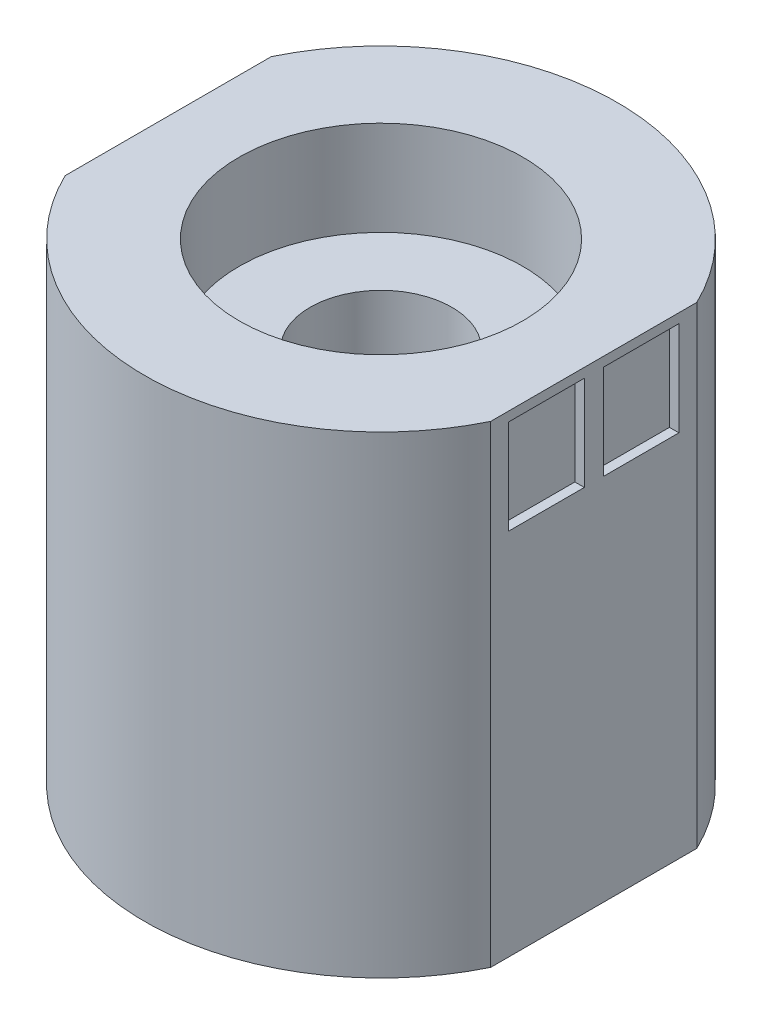
ISO-10303-21;
HEADER;
FILE_DESCRIPTION(('STEP AP214'),'2;1');
FILE_NAME('part.step','',(''),(''),'','','');
FILE_SCHEMA(('AUTOMOTIVE_DESIGN { 1 0 10303 214 1 1 1 1 }'));
ENDSEC;
DATA;
#1=APPLICATION_CONTEXT('core data for automotive mechanical design processes');
#2=APPLICATION_PROTOCOL_DEFINITION('international standard','automotive_design',2000,#1);
#3=PRODUCT_CONTEXT('',#1,'mechanical');
#4=PRODUCT('Part','Part','',(#3));
#5=PRODUCT_RELATED_PRODUCT_CATEGORY('part','',(#4));
#6=PRODUCT_DEFINITION_FORMATION('','',#4);
#7=PRODUCT_DEFINITION_CONTEXT('part definition',#1,'design');
#8=PRODUCT_DEFINITION('design','',#6,#7);
#9=PRODUCT_DEFINITION_SHAPE('','',#8);
#10=(LENGTH_UNIT() NAMED_UNIT(*) SI_UNIT(.MILLI.,.METRE.));
#11=(NAMED_UNIT(*) PLANE_ANGLE_UNIT() SI_UNIT($,.RADIAN.));
#12=(NAMED_UNIT(*) SI_UNIT($,.STERADIAN.) SOLID_ANGLE_UNIT());
#13=UNCERTAINTY_MEASURE_WITH_UNIT(LENGTH_MEASURE(1.E-05),#10,'distance_accuracy_value','');
#14=(GEOMETRIC_REPRESENTATION_CONTEXT(3) GLOBAL_UNCERTAINTY_ASSIGNED_CONTEXT((#13)) GLOBAL_UNIT_ASSIGNED_CONTEXT((#10,
#11,#12)) REPRESENTATION_CONTEXT('',''));
#15=CARTESIAN_POINT('',(0.,0.,0.));
#16=DIRECTION('',(0.,0.,1.));
#17=DIRECTION('',(1.,0.,0.));
#18=AXIS2_PLACEMENT_3D('',#15,#16,#17);
#19=CARTESIAN_POINT('',(22.5,0.,-10.8972473588517));
#20=DIRECTION('',(1.,0.,0.));
#21=DIRECTION('',(0.,0.,-1.));
#22=AXIS2_PLACEMENT_3D('',#19,#20,#21);
#23=PLANE('',#22);
#24=DIRECTION('',(0.,0.,-1.));
#25=VECTOR('',#24,1.);
#26=CARTESIAN_POINT('',(22.5,50.,-10.8972473588517));
#27=LINE('',#26,#25);
#28=CARTESIAN_POINT('',(22.5,50.,10.8972473588517));
#29=VERTEX_POINT('',#28);
#30=CARTESIAN_POINT('',(22.5,50.,-10.8972473588517));
#31=VERTEX_POINT('',#30);
#32=EDGE_CURVE('E310',#29,#31,#27,.T.);
#33=ORIENTED_EDGE('',*,*,#32,.F.);
#34=DIRECTION('',(0.,1.,0.));
#35=VECTOR('',#34,1.);
#36=CARTESIAN_POINT('',(22.5,0.,10.8972473588517));
#37=LINE('',#36,#35);
#38=CARTESIAN_POINT('',(22.5,0.,10.8972473588517));
#39=VERTEX_POINT('',#38);
#40=EDGE_CURVE('E320',#39,#29,#37,.T.);
#41=ORIENTED_EDGE('',*,*,#40,.F.);
#42=DIRECTION('',(0.,0.,-1.));
#43=VECTOR('',#42,1.);
#44=CARTESIAN_POINT('',(22.5,0.,-10.8972473588517));
#45=LINE('',#44,#43);
#46=CARTESIAN_POINT('',(22.5,0.,-10.8972473588517));
#47=VERTEX_POINT('',#46);
#48=EDGE_CURVE('E309',#39,#47,#45,.T.);
#49=ORIENTED_EDGE('',*,*,#48,.T.);
#50=DIRECTION('',(0.,1.,0.));
#51=VECTOR('',#50,1.);
#52=CARTESIAN_POINT('',(22.5,0.,-10.8972473588517));
#53=LINE('',#52,#51);
#54=EDGE_CURVE('E317',#47,#31,#53,.T.);
#55=ORIENTED_EDGE('',*,*,#54,.T.);
#56=EDGE_LOOP('',(#33,#41,#49,#55));
#57=FACE_BOUND('',#56,.T.);
#58=DIRECTION('',(0.,0.,1.));
#59=VECTOR('',#58,1.);
#60=CARTESIAN_POINT('',(22.5,39.,9.));
#61=LINE('',#60,#59);
#62=CARTESIAN_POINT('',(22.5,39.,1.));
#63=VERTEX_POINT('',#62);
#64=CARTESIAN_POINT('',(22.5,39.,9.));
#65=VERTEX_POINT('',#64);
#66=EDGE_CURVE('E229',#63,#65,#61,.T.);
#67=ORIENTED_EDGE('',*,*,#66,.T.);
#68=DIRECTION('',(0.,1.,0.));
#69=VECTOR('',#68,1.);
#70=CARTESIAN_POINT('',(22.5,49.,9.));
#71=LINE('',#70,#69);
#72=CARTESIAN_POINT('',(22.5,49.,9.));
#73=VERTEX_POINT('',#72);
#74=EDGE_CURVE('E61',#65,#73,#71,.T.);
#75=ORIENTED_EDGE('',*,*,#74,.T.);
#76=DIRECTION('',(0.,0.,-1.));
#77=VECTOR('',#76,1.);
#78=CARTESIAN_POINT('',(22.5,49.,9.));
#79=LINE('',#78,#77);
#80=CARTESIAN_POINT('',(22.5,49.,1.));
#81=VERTEX_POINT('',#80);
#82=EDGE_CURVE('E221',#73,#81,#79,.T.);
#83=ORIENTED_EDGE('',*,*,#82,.T.);
#84=DIRECTION('',(0.,-1.,0.));
#85=VECTOR('',#84,1.);
#86=CARTESIAN_POINT('',(22.5,49.,1.));
#87=LINE('',#86,#85);
#88=EDGE_CURVE('E232',#81,#63,#87,.T.);
#89=ORIENTED_EDGE('',*,*,#88,.T.);
#90=EDGE_LOOP('',(#67,#75,#83,#89));
#91=FACE_BOUND('',#90,.T.);
#92=DIRECTION('',(0.,0.,-1.));
#93=VECTOR('',#92,1.);
#94=CARTESIAN_POINT('',(22.5,49.,-9.));
#95=LINE('',#94,#93);
#96=CARTESIAN_POINT('',(22.5,49.,-0.999999999999999));
#97=VERTEX_POINT('',#96);
#98=CARTESIAN_POINT('',(22.5,49.,-9.));
#99=VERTEX_POINT('',#98);
#100=EDGE_CURVE('E206',#97,#99,#95,.T.);
#101=ORIENTED_EDGE('',*,*,#100,.T.);
#102=DIRECTION('',(0.,-1.,0.));
#103=VECTOR('',#102,1.);
#104=CARTESIAN_POINT('',(22.5,49.,-9.));
#105=LINE('',#104,#103);
#106=CARTESIAN_POINT('',(22.5,39.,-9.));
#107=VERTEX_POINT('',#106);
#108=EDGE_CURVE('E53',#99,#107,#105,.T.);
#109=ORIENTED_EDGE('',*,*,#108,.T.);
#110=DIRECTION('',(0.,0.,1.));
#111=VECTOR('',#110,1.);
#112=CARTESIAN_POINT('',(22.5,39.,-9.));
#113=LINE('',#112,#111);
#114=CARTESIAN_POINT('',(22.5,39.,-0.999999999999997));
#115=VERTEX_POINT('',#114);
#116=EDGE_CURVE('E197',#107,#115,#113,.T.);
#117=ORIENTED_EDGE('',*,*,#116,.T.);
#118=DIRECTION('',(0.,1.,0.));
#119=VECTOR('',#118,1.);
#120=CARTESIAN_POINT('',(22.5,49.,-0.999999999999999));
#121=LINE('',#120,#119);
#122=EDGE_CURVE('E200',#115,#97,#121,.T.);
#123=ORIENTED_EDGE('',*,*,#122,.T.);
#124=EDGE_LOOP('',(#101,#109,#117,#123));
#125=FACE_BOUND('',#124,.T.);
#126=ADVANCED_FACE('F36',(#57,#91,#125),#23,.T.);
#127=CARTESIAN_POINT('',(0.,50.,0.));
#128=DIRECTION('',(0.,1.,0.));
#129=DIRECTION('',(0.,0.,1.));
#130=AXIS2_PLACEMENT_3D('',#127,#128,#129);
#131=PLANE('',#130);
#132=CARTESIAN_POINT('',(0.,50.,0.));
#133=DIRECTION('',(0.,1.,0.));
#134=DIRECTION('',(0.,0.,1.));
#135=AXIS2_PLACEMENT_3D('',#132,#133,#134);
#136=CIRCLE('',#135,15.);
#137=CARTESIAN_POINT('',(0.,50.,15.));
#138=VERTEX_POINT('',#137);
#139=EDGE_CURVE('E319',#138,#138,#136,.T.);
#140=ORIENTED_EDGE('',*,*,#139,.F.);
#141=EDGE_LOOP('',(#140));
#142=FACE_BOUND('',#141,.T.);
#143=CARTESIAN_POINT('',(0.,50.,0.));
#144=DIRECTION('',(0.,1.,0.));
#145=DIRECTION('',(0.,0.,1.));
#146=AXIS2_PLACEMENT_3D('',#143,#144,#145);
#147=CIRCLE('',#146,25.);
#148=CARTESIAN_POINT('',(-22.5,50.,10.8972473588517));
#149=VERTEX_POINT('',#148);
#150=EDGE_CURVE('E45',#149,#29,#147,.T.);
#151=ORIENTED_EDGE('',*,*,#150,.T.);
#152=ORIENTED_EDGE('',*,*,#32,.T.);
#153=CARTESIAN_POINT('',(-22.5,50.,-10.8972473588517));
#154=VERTEX_POINT('',#153);
#155=EDGE_CURVE('E12',#31,#154,#147,.T.);
#156=ORIENTED_EDGE('',*,*,#155,.T.);
#157=DIRECTION('',(0.,0.,1.));
#158=VECTOR('',#157,1.);
#159=CARTESIAN_POINT('',(-22.5,50.,-10.8972473588517));
#160=LINE('',#159,#158);
#161=EDGE_CURVE('E270',#154,#149,#160,.T.);
#162=ORIENTED_EDGE('',*,*,#161,.T.);
#163=EDGE_LOOP('',(#151,#152,#156,#162));
#164=FACE_BOUND('',#163,.T.);
#165=ADVANCED_FACE('F355',(#142,#164),#131,.T.);
#166=CARTESIAN_POINT('',(0.,0.,0.));
#167=DIRECTION('',(0.,1.,0.));
#168=DIRECTION('',(0.,0.,1.));
#169=AXIS2_PLACEMENT_3D('',#166,#167,#168);
#170=PLANE('',#169);
#171=CARTESIAN_POINT('',(0.,0.,0.));
#172=DIRECTION('',(0.,1.,0.));
#173=DIRECTION('',(0.,0.,1.));
#174=AXIS2_PLACEMENT_3D('',#171,#172,#173);
#175=CIRCLE('',#174,7.5);
#176=CARTESIAN_POINT('',(0.,0.,7.5));
#177=VERTEX_POINT('',#176);
#178=EDGE_CURVE('E332',#177,#177,#175,.T.);
#179=ORIENTED_EDGE('',*,*,#178,.T.);
#180=EDGE_LOOP('',(#179));
#181=FACE_BOUND('',#180,.T.);
#182=ORIENTED_EDGE('',*,*,#48,.F.);
#183=CARTESIAN_POINT('',(0.,0.,0.));
#184=DIRECTION('',(0.,1.,0.));
#185=DIRECTION('',(0.,0.,1.));
#186=AXIS2_PLACEMENT_3D('',#183,#184,#185);
#187=CIRCLE('',#186,25.);
#188=CARTESIAN_POINT('',(-22.5,0.,10.8972473588517));
#189=VERTEX_POINT('',#188);
#190=EDGE_CURVE('E334',#189,#39,#187,.T.);
#191=ORIENTED_EDGE('',*,*,#190,.F.);
#192=DIRECTION('',(0.,0.,1.));
#193=VECTOR('',#192,1.);
#194=CARTESIAN_POINT('',(-22.5,0.,-10.8972473588517));
#195=LINE('',#194,#193);
#196=CARTESIAN_POINT('',(-22.5,0.,-10.8972473588517));
#197=VERTEX_POINT('',#196);
#198=EDGE_CURVE('E307',#197,#189,#195,.T.);
#199=ORIENTED_EDGE('',*,*,#198,.F.);
#200=EDGE_CURVE('E336',#47,#197,#187,.T.);
#201=ORIENTED_EDGE('',*,*,#200,.F.);
#202=EDGE_LOOP('',(#182,#191,#199,#201));
#203=FACE_BOUND('',#202,.T.);
#204=ADVANCED_FACE('F350',(#181,#203),#170,.F.);
#205=CARTESIAN_POINT('',(0.,50.,0.));
#206=DIRECTION('',(0.,-1.,0.));
#207=DIRECTION('',(0.,0.,-1.));
#208=AXIS2_PLACEMENT_3D('',#205,#206,#207);
#209=CYLINDRICAL_SURFACE('',#208,25.);
#210=ORIENTED_EDGE('',*,*,#40,.T.);
#211=ORIENTED_EDGE('',*,*,#150,.F.);
#212=DIRECTION('',(0.,1.,0.));
#213=VECTOR('',#212,1.);
#214=CARTESIAN_POINT('',(-22.5,0.,10.8972473588517));
#215=LINE('',#214,#213);
#216=EDGE_CURVE('E323',#189,#149,#215,.T.);
#217=ORIENTED_EDGE('',*,*,#216,.F.);
#218=ORIENTED_EDGE('',*,*,#190,.T.);
#219=EDGE_LOOP('',(#210,#211,#217,#218));
#220=FACE_BOUND('',#219,.T.);
#221=ADVANCED_FACE('F38',(#220),#209,.T.);
#222=ORIENTED_EDGE('',*,*,#54,.F.);
#223=ORIENTED_EDGE('',*,*,#200,.T.);
#224=DIRECTION('',(0.,1.,0.));
#225=VECTOR('',#224,1.);
#226=CARTESIAN_POINT('',(-22.5,0.,-10.8972473588517));
#227=LINE('',#226,#225);
#228=EDGE_CURVE('E312',#197,#154,#227,.T.);
#229=ORIENTED_EDGE('',*,*,#228,.T.);
#230=ORIENTED_EDGE('',*,*,#155,.F.);
#231=EDGE_LOOP('',(#222,#223,#229,#230));
#232=FACE_BOUND('',#231,.T.);
#233=ADVANCED_FACE('F345',(#232),#209,.T.);
#234=CARTESIAN_POINT('',(0.,50.,0.));
#235=DIRECTION('',(0.,-1.,0.));
#236=DIRECTION('',(0.,0.,-1.));
#237=AXIS2_PLACEMENT_3D('',#234,#235,#236);
#238=CYLINDRICAL_SURFACE('',#237,7.5);
#239=ORIENTED_EDGE('',*,*,#178,.F.);
#240=EDGE_LOOP('',(#239));
#241=FACE_BOUND('',#240,.T.);
#242=CARTESIAN_POINT('',(0.,40.,0.));
#243=DIRECTION('',(0.,1.,0.));
#244=DIRECTION('',(0.,0.,1.));
#245=AXIS2_PLACEMENT_3D('',#242,#243,#244);
#246=CIRCLE('',#245,7.5);
#247=CARTESIAN_POINT('',(0.,40.,7.5));
#248=VERTEX_POINT('',#247);
#249=EDGE_CURVE('E40',#248,#248,#246,.T.);
#250=ORIENTED_EDGE('',*,*,#249,.T.);
#251=EDGE_LOOP('',(#250));
#252=FACE_BOUND('',#251,.T.);
#253=ADVANCED_FACE('F449',(#241,#252),#238,.F.);
#254=CARTESIAN_POINT('',(0.,40.,0.));
#255=DIRECTION('',(0.,1.,0.));
#256=DIRECTION('',(0.,0.,1.));
#257=AXIS2_PLACEMENT_3D('',#254,#255,#256);
#258=CYLINDRICAL_SURFACE('',#257,15.);
#259=CARTESIAN_POINT('',(0.,40.,0.));
#260=DIRECTION('',(0.,1.,0.));
#261=DIRECTION('',(0.,0.,1.));
#262=AXIS2_PLACEMENT_3D('',#259,#260,#261);
#263=CIRCLE('',#262,15.);
#264=CARTESIAN_POINT('',(0.,40.,15.));
#265=VERTEX_POINT('',#264);
#266=EDGE_CURVE('E327',#265,#265,#263,.T.);
#267=ORIENTED_EDGE('',*,*,#266,.F.);
#268=EDGE_LOOP('',(#267));
#269=FACE_BOUND('',#268,.T.);
#270=ORIENTED_EDGE('',*,*,#139,.T.);
#271=EDGE_LOOP('',(#270));
#272=FACE_BOUND('',#271,.T.);
#273=ADVANCED_FACE('F445',(#269,#272),#258,.F.);
#274=CARTESIAN_POINT('',(0.,40.,0.));
#275=DIRECTION('',(0.,1.,0.));
#276=DIRECTION('',(0.,0.,1.));
#277=AXIS2_PLACEMENT_3D('',#274,#275,#276);
#278=PLANE('',#277);
#279=ORIENTED_EDGE('',*,*,#249,.F.);
#280=EDGE_LOOP('',(#279));
#281=FACE_BOUND('',#280,.T.);
#282=ORIENTED_EDGE('',*,*,#266,.T.);
#283=EDGE_LOOP('',(#282));
#284=FACE_BOUND('',#283,.T.);
#285=ADVANCED_FACE('F441',(#281,#284),#278,.T.);
#286=CARTESIAN_POINT('',(-22.5,0.,-10.8972473588517));
#287=DIRECTION('',(-1.,0.,0.));
#288=DIRECTION('',(0.,0.,1.));
#289=AXIS2_PLACEMENT_3D('',#286,#287,#288);
#290=PLANE('',#289);
#291=DIRECTION('',(0.,-1.,0.));
#292=VECTOR('',#291,1.);
#293=CARTESIAN_POINT('',(-22.5,49.,-9.));
#294=LINE('',#293,#292);
#295=CARTESIAN_POINT('',(-22.5,49.,-9.));
#296=VERTEX_POINT('',#295);
#297=CARTESIAN_POINT('',(-22.5,39.,-9.));
#298=VERTEX_POINT('',#297);
#299=EDGE_CURVE('E257',#296,#298,#294,.T.);
#300=ORIENTED_EDGE('',*,*,#299,.F.);
#301=DIRECTION('',(0.,0.,-1.));
#302=VECTOR('',#301,1.);
#303=CARTESIAN_POINT('',(-22.5,49.,-9.));
#304=LINE('',#303,#302);
#305=CARTESIAN_POINT('',(-22.5,49.,-0.999999999999999));
#306=VERTEX_POINT('',#305);
#307=EDGE_CURVE('E247',#306,#296,#304,.T.);
#308=ORIENTED_EDGE('',*,*,#307,.F.);
#309=DIRECTION('',(0.,1.,0.));
#310=VECTOR('',#309,1.);
#311=CARTESIAN_POINT('',(-22.5,49.,-0.999999999999999));
#312=LINE('',#311,#310);
#313=CARTESIAN_POINT('',(-22.5,39.,-0.999999999999997));
#314=VERTEX_POINT('',#313);
#315=EDGE_CURVE('E263',#314,#306,#312,.T.);
#316=ORIENTED_EDGE('',*,*,#315,.F.);
#317=DIRECTION('',(0.,0.,1.));
#318=VECTOR('',#317,1.);
#319=CARTESIAN_POINT('',(-22.5,39.,-9.));
#320=LINE('',#319,#318);
#321=EDGE_CURVE('E259',#298,#314,#320,.T.);
#322=ORIENTED_EDGE('',*,*,#321,.F.);
#323=EDGE_LOOP('',(#300,#308,#316,#322));
#324=FACE_BOUND('',#323,.T.);
#325=DIRECTION('',(0.,1.,0.));
#326=VECTOR('',#325,1.);
#327=CARTESIAN_POINT('',(-22.5,49.,9.));
#328=LINE('',#327,#326);
#329=CARTESIAN_POINT('',(-22.5,39.,9.));
#330=VERTEX_POINT('',#329);
#331=CARTESIAN_POINT('',(-22.5,49.,9.));
#332=VERTEX_POINT('',#331);
#333=EDGE_CURVE('E213',#330,#332,#328,.T.);
#334=ORIENTED_EDGE('',*,*,#333,.F.);
#335=DIRECTION('',(0.,0.,1.));
#336=VECTOR('',#335,1.);
#337=CARTESIAN_POINT('',(-22.5,39.,9.));
#338=LINE('',#337,#336);
#339=CARTESIAN_POINT('',(-22.5,39.,1.));
#340=VERTEX_POINT('',#339);
#341=EDGE_CURVE('E281',#340,#330,#338,.T.);
#342=ORIENTED_EDGE('',*,*,#341,.F.);
#343=DIRECTION('',(0.,-1.,0.));
#344=VECTOR('',#343,1.);
#345=CARTESIAN_POINT('',(-22.5,49.,1.));
#346=LINE('',#345,#344);
#347=CARTESIAN_POINT('',(-22.5,49.,1.));
#348=VERTEX_POINT('',#347);
#349=EDGE_CURVE('E295',#348,#340,#346,.T.);
#350=ORIENTED_EDGE('',*,*,#349,.F.);
#351=DIRECTION('',(0.,0.,-1.));
#352=VECTOR('',#351,1.);
#353=CARTESIAN_POINT('',(-22.5,49.,9.));
#354=LINE('',#353,#352);
#355=EDGE_CURVE('E292',#332,#348,#354,.T.);
#356=ORIENTED_EDGE('',*,*,#355,.F.);
#357=EDGE_LOOP('',(#334,#342,#350,#356));
#358=FACE_BOUND('',#357,.T.);
#359=ORIENTED_EDGE('',*,*,#161,.F.);
#360=ORIENTED_EDGE('',*,*,#228,.F.);
#361=ORIENTED_EDGE('',*,*,#198,.T.);
#362=ORIENTED_EDGE('',*,*,#216,.T.);
#363=EDGE_LOOP('',(#359,#360,#361,#362));
#364=FACE_BOUND('',#363,.T.);
#365=ADVANCED_FACE('F352',(#324,#358,#364),#290,.T.);
#366=CARTESIAN_POINT('',(-21.5,49.,9.));
#367=DIRECTION('',(0.,0.,1.));
#368=DIRECTION('',(1.,0.,0.));
#369=AXIS2_PLACEMENT_3D('',#366,#367,#368);
#370=PLANE('',#369);
#371=ORIENTED_EDGE('',*,*,#333,.T.);
#372=DIRECTION('',(-1.,0.,0.));
#373=VECTOR('',#372,1.);
#374=CARTESIAN_POINT('',(-21.5,49.,9.));
#375=LINE('',#374,#373);
#376=CARTESIAN_POINT('',(-21.5,49.,9.));
#377=VERTEX_POINT('',#376);
#378=EDGE_CURVE('E290',#377,#332,#375,.T.);
#379=ORIENTED_EDGE('',*,*,#378,.F.);
#380=DIRECTION('',(0.,1.,0.));
#381=VECTOR('',#380,1.);
#382=CARTESIAN_POINT('',(-21.5,49.,9.));
#383=LINE('',#382,#381);
#384=CARTESIAN_POINT('',(-21.5,39.,9.));
#385=VERTEX_POINT('',#384);
#386=EDGE_CURVE('E277',#385,#377,#383,.T.);
#387=ORIENTED_EDGE('',*,*,#386,.F.);
#388=DIRECTION('',(-1.,0.,0.));
#389=VECTOR('',#388,1.);
#390=CARTESIAN_POINT('',(-21.5,39.,9.));
#391=LINE('',#390,#389);
#392=EDGE_CURVE('E260',#385,#330,#391,.T.);
#393=ORIENTED_EDGE('',*,*,#392,.T.);
#394=EDGE_LOOP('',(#371,#379,#387,#393));
#395=FACE_BOUND('',#394,.T.);
#396=ADVANCED_FACE('F428',(#395),#370,.F.);
#397=CARTESIAN_POINT('',(-21.5,39.,9.));
#398=DIRECTION('',(0.,-1.,0.));
#399=DIRECTION('',(0.,0.,-1.));
#400=AXIS2_PLACEMENT_3D('',#397,#398,#399);
#401=PLANE('',#400);
#402=ORIENTED_EDGE('',*,*,#341,.T.);
#403=ORIENTED_EDGE('',*,*,#392,.F.);
#404=DIRECTION('',(0.,0.,1.));
#405=VECTOR('',#404,1.);
#406=CARTESIAN_POINT('',(-21.5,39.,9.));
#407=LINE('',#406,#405);
#408=CARTESIAN_POINT('',(-21.5,39.,1.));
#409=VERTEX_POINT('',#408);
#410=EDGE_CURVE('E287',#409,#385,#407,.T.);
#411=ORIENTED_EDGE('',*,*,#410,.F.);
#412=DIRECTION('',(-1.,0.,0.));
#413=VECTOR('',#412,1.);
#414=CARTESIAN_POINT('',(-21.5,39.,1.));
#415=LINE('',#414,#413);
#416=EDGE_CURVE('E301',#409,#340,#415,.T.);
#417=ORIENTED_EDGE('',*,*,#416,.T.);
#418=EDGE_LOOP('',(#402,#403,#411,#417));
#419=FACE_BOUND('',#418,.T.);
#420=ADVANCED_FACE('F424',(#419),#401,.F.);
#421=CARTESIAN_POINT('',(-21.5,49.,1.));
#422=DIRECTION('',(0.,0.,-1.));
#423=DIRECTION('',(0.,1.,0.));
#424=AXIS2_PLACEMENT_3D('',#421,#422,#423);
#425=PLANE('',#424);
#426=ORIENTED_EDGE('',*,*,#349,.T.);
#427=ORIENTED_EDGE('',*,*,#416,.F.);
#428=DIRECTION('',(0.,-1.,0.));
#429=VECTOR('',#428,1.);
#430=CARTESIAN_POINT('',(-21.5,49.,1.));
#431=LINE('',#430,#429);
#432=CARTESIAN_POINT('',(-21.5,49.,1.));
#433=VERTEX_POINT('',#432);
#434=EDGE_CURVE('E284',#433,#409,#431,.T.);
#435=ORIENTED_EDGE('',*,*,#434,.F.);
#436=DIRECTION('',(-1.,0.,0.));
#437=VECTOR('',#436,1.);
#438=CARTESIAN_POINT('',(-21.5,49.,1.));
#439=LINE('',#438,#437);
#440=EDGE_CURVE('E303',#433,#348,#439,.T.);
#441=ORIENTED_EDGE('',*,*,#440,.T.);
#442=EDGE_LOOP('',(#426,#427,#435,#441));
#443=FACE_BOUND('',#442,.T.);
#444=ADVANCED_FACE('F427',(#443),#425,.F.);
#445=CARTESIAN_POINT('',(-21.5,49.,9.));
#446=DIRECTION('',(0.,1.,0.));
#447=DIRECTION('',(0.,0.,1.));
#448=AXIS2_PLACEMENT_3D('',#445,#446,#447);
#449=PLANE('',#448);
#450=ORIENTED_EDGE('',*,*,#355,.T.);
#451=ORIENTED_EDGE('',*,*,#440,.F.);
#452=DIRECTION('',(0.,0.,-1.));
#453=VECTOR('',#452,1.);
#454=CARTESIAN_POINT('',(-21.5,49.,9.));
#455=LINE('',#454,#453);
#456=EDGE_CURVE('E280',#377,#433,#455,.T.);
#457=ORIENTED_EDGE('',*,*,#456,.F.);
#458=ORIENTED_EDGE('',*,*,#378,.T.);
#459=EDGE_LOOP('',(#450,#451,#457,#458));
#460=FACE_BOUND('',#459,.T.);
#461=ADVANCED_FACE('F422',(#460),#449,.F.);
#462=CARTESIAN_POINT('',(-21.5,0.,0.));
#463=DIRECTION('',(1.,0.,0.));
#464=DIRECTION('',(0.,0.,-1.));
#465=AXIS2_PLACEMENT_3D('',#462,#463,#464);
#466=PLANE('',#465);
#467=ORIENTED_EDGE('',*,*,#386,.T.);
#468=ORIENTED_EDGE('',*,*,#456,.T.);
#469=ORIENTED_EDGE('',*,*,#434,.T.);
#470=ORIENTED_EDGE('',*,*,#410,.T.);
#471=EDGE_LOOP('',(#467,#468,#469,#470));
#472=FACE_BOUND('',#471,.T.);
#473=ADVANCED_FACE('F418',(#472),#466,.F.);
#474=CARTESIAN_POINT('',(-21.5,49.,-9.));
#475=DIRECTION('',(0.,0.,-1.));
#476=DIRECTION('',(0.,1.,0.));
#477=AXIS2_PLACEMENT_3D('',#474,#475,#476);
#478=PLANE('',#477);
#479=ORIENTED_EDGE('',*,*,#299,.T.);
#480=DIRECTION('',(-1.,0.,0.));
#481=VECTOR('',#480,1.);
#482=CARTESIAN_POINT('',(-21.5,39.,-9.));
#483=LINE('',#482,#481);
#484=CARTESIAN_POINT('',(-21.5,39.,-9.));
#485=VERTEX_POINT('',#484);
#486=EDGE_CURVE('E256',#485,#298,#483,.T.);
#487=ORIENTED_EDGE('',*,*,#486,.F.);
#488=DIRECTION('',(0.,-1.,0.));
#489=VECTOR('',#488,1.);
#490=CARTESIAN_POINT('',(-21.5,49.,-9.));
#491=LINE('',#490,#489);
#492=CARTESIAN_POINT('',(-21.5,49.,-9.));
#493=VERTEX_POINT('',#492);
#494=EDGE_CURVE('E243',#493,#485,#491,.T.);
#495=ORIENTED_EDGE('',*,*,#494,.F.);
#496=DIRECTION('',(-1.,0.,0.));
#497=VECTOR('',#496,1.);
#498=CARTESIAN_POINT('',(-21.5,49.,-9.));
#499=LINE('',#498,#497);
#500=EDGE_CURVE('E268',#493,#296,#499,.T.);
#501=ORIENTED_EDGE('',*,*,#500,.T.);
#502=EDGE_LOOP('',(#479,#487,#495,#501));
#503=FACE_BOUND('',#502,.T.);
#504=ADVANCED_FACE('F408',(#503),#478,.F.);
#505=CARTESIAN_POINT('',(-21.5,49.,-9.));
#506=DIRECTION('',(0.,1.,0.));
#507=DIRECTION('',(0.,0.,1.));
#508=AXIS2_PLACEMENT_3D('',#505,#506,#507);
#509=PLANE('',#508);
#510=ORIENTED_EDGE('',*,*,#307,.T.);
#511=ORIENTED_EDGE('',*,*,#500,.F.);
#512=DIRECTION('',(0.,0.,-1.));
#513=VECTOR('',#512,1.);
#514=CARTESIAN_POINT('',(-21.5,49.,-9.));
#515=LINE('',#514,#513);
#516=CARTESIAN_POINT('',(-21.5,49.,-0.999999999999999));
#517=VERTEX_POINT('',#516);
#518=EDGE_CURVE('E253',#517,#493,#515,.T.);
#519=ORIENTED_EDGE('',*,*,#518,.F.);
#520=DIRECTION('',(-1.,0.,0.));
#521=VECTOR('',#520,1.);
#522=CARTESIAN_POINT('',(-21.5,49.,-0.999999999999999));
#523=LINE('',#522,#521);
#524=EDGE_CURVE('E271',#517,#306,#523,.T.);
#525=ORIENTED_EDGE('',*,*,#524,.T.);
#526=EDGE_LOOP('',(#510,#511,#519,#525));
#527=FACE_BOUND('',#526,.T.);
#528=ADVANCED_FACE('F404',(#527),#509,.F.);
#529=CARTESIAN_POINT('',(-21.5,49.,-0.999999999999999));
#530=DIRECTION('',(0.,0.,1.));
#531=DIRECTION('',(0.,-1.,0.));
#532=AXIS2_PLACEMENT_3D('',#529,#530,#531);
#533=PLANE('',#532);
#534=ORIENTED_EDGE('',*,*,#315,.T.);
#535=ORIENTED_EDGE('',*,*,#524,.F.);
#536=DIRECTION('',(0.,1.,0.));
#537=VECTOR('',#536,1.);
#538=CARTESIAN_POINT('',(-21.5,49.,-0.999999999999999));
#539=LINE('',#538,#537);
#540=CARTESIAN_POINT('',(-21.5,39.,-0.999999999999997));
#541=VERTEX_POINT('',#540);
#542=EDGE_CURVE('E250',#541,#517,#539,.T.);
#543=ORIENTED_EDGE('',*,*,#542,.F.);
#544=DIRECTION('',(-1.,0.,0.));
#545=VECTOR('',#544,1.);
#546=CARTESIAN_POINT('',(-21.5,39.,-0.999999999999997));
#547=LINE('',#546,#545);
#548=EDGE_CURVE('E273',#541,#314,#547,.T.);
#549=ORIENTED_EDGE('',*,*,#548,.T.);
#550=EDGE_LOOP('',(#534,#535,#543,#549));
#551=FACE_BOUND('',#550,.T.);
#552=ADVANCED_FACE('F407',(#551),#533,.F.);
#553=CARTESIAN_POINT('',(-21.5,39.,-9.));
#554=DIRECTION('',(0.,-1.,0.));
#555=DIRECTION('',(0.,0.,-1.));
#556=AXIS2_PLACEMENT_3D('',#553,#554,#555);
#557=PLANE('',#556);
#558=ORIENTED_EDGE('',*,*,#321,.T.);
#559=ORIENTED_EDGE('',*,*,#548,.F.);
#560=DIRECTION('',(0.,0.,1.));
#561=VECTOR('',#560,1.);
#562=CARTESIAN_POINT('',(-21.5,39.,-9.));
#563=LINE('',#562,#561);
#564=EDGE_CURVE('E246',#485,#541,#563,.T.);
#565=ORIENTED_EDGE('',*,*,#564,.F.);
#566=ORIENTED_EDGE('',*,*,#486,.T.);
#567=EDGE_LOOP('',(#558,#559,#565,#566));
#568=FACE_BOUND('',#567,.T.);
#569=ADVANCED_FACE('F402',(#568),#557,.F.);
#570=CARTESIAN_POINT('',(-21.5,0.,0.));
#571=DIRECTION('',(-1.,0.,0.));
#572=DIRECTION('',(0.,0.,1.));
#573=AXIS2_PLACEMENT_3D('',#570,#571,#572);
#574=PLANE('',#573);
#575=ORIENTED_EDGE('',*,*,#494,.T.);
#576=ORIENTED_EDGE('',*,*,#564,.T.);
#577=ORIENTED_EDGE('',*,*,#542,.T.);
#578=ORIENTED_EDGE('',*,*,#518,.T.);
#579=EDGE_LOOP('',(#575,#576,#577,#578));
#580=FACE_BOUND('',#579,.T.);
#581=ADVANCED_FACE('F399',(#580),#574,.T.);
#582=CARTESIAN_POINT('',(21.5,49.,9.));
#583=DIRECTION('',(0.,0.,-1.));
#584=DIRECTION('',(-1.,0.,0.));
#585=AXIS2_PLACEMENT_3D('',#582,#583,#584);
#586=PLANE('',#585);
#587=ORIENTED_EDGE('',*,*,#74,.F.);
#588=DIRECTION('',(1.,0.,0.));
#589=VECTOR('',#588,1.);
#590=CARTESIAN_POINT('',(21.5,39.,9.));
#591=LINE('',#590,#589);
#592=CARTESIAN_POINT('',(21.5,39.,9.));
#593=VERTEX_POINT('',#592);
#594=EDGE_CURVE('E227',#593,#65,#591,.T.);
#595=ORIENTED_EDGE('',*,*,#594,.F.);
#596=DIRECTION('',(0.,1.,0.));
#597=VECTOR('',#596,1.);
#598=CARTESIAN_POINT('',(21.5,49.,9.));
#599=LINE('',#598,#597);
#600=CARTESIAN_POINT('',(21.5,49.,9.));
#601=VERTEX_POINT('',#600);
#602=EDGE_CURVE('E217',#593,#601,#599,.T.);
#603=ORIENTED_EDGE('',*,*,#602,.T.);
#604=DIRECTION('',(1.,0.,0.));
#605=VECTOR('',#604,1.);
#606=CARTESIAN_POINT('',(21.5,49.,9.));
#607=LINE('',#606,#605);
#608=EDGE_CURVE('E207',#601,#73,#607,.T.);
#609=ORIENTED_EDGE('',*,*,#608,.T.);
#610=EDGE_LOOP('',(#587,#595,#603,#609));
#611=FACE_BOUND('',#610,.T.);
#612=ADVANCED_FACE('F389',(#611),#586,.T.);
#613=CARTESIAN_POINT('',(21.5,49.,9.));
#614=DIRECTION('',(0.,-1.,0.));
#615=DIRECTION('',(0.,0.,-1.));
#616=AXIS2_PLACEMENT_3D('',#613,#614,#615);
#617=PLANE('',#616);
#618=ORIENTED_EDGE('',*,*,#82,.F.);
#619=ORIENTED_EDGE('',*,*,#608,.F.);
#620=DIRECTION('',(0.,0.,-1.));
#621=VECTOR('',#620,1.);
#622=CARTESIAN_POINT('',(21.5,49.,9.));
#623=LINE('',#622,#621);
#624=CARTESIAN_POINT('',(21.5,49.,1.));
#625=VERTEX_POINT('',#624);
#626=EDGE_CURVE('E225',#601,#625,#623,.T.);
#627=ORIENTED_EDGE('',*,*,#626,.T.);
#628=DIRECTION('',(1.,0.,0.));
#629=VECTOR('',#628,1.);
#630=CARTESIAN_POINT('',(21.5,49.,1.));
#631=LINE('',#630,#629);
#632=EDGE_CURVE('E238',#625,#81,#631,.T.);
#633=ORIENTED_EDGE('',*,*,#632,.T.);
#634=EDGE_LOOP('',(#618,#619,#627,#633));
#635=FACE_BOUND('',#634,.T.);
#636=ADVANCED_FACE('F385',(#635),#617,.T.);
#637=CARTESIAN_POINT('',(21.5,49.,1.));
#638=DIRECTION('',(0.,0.,1.));
#639=DIRECTION('',(0.,-1.,0.));
#640=AXIS2_PLACEMENT_3D('',#637,#638,#639);
#641=PLANE('',#640);
#642=ORIENTED_EDGE('',*,*,#88,.F.);
#643=ORIENTED_EDGE('',*,*,#632,.F.);
#644=DIRECTION('',(0.,-1.,0.));
#645=VECTOR('',#644,1.);
#646=CARTESIAN_POINT('',(21.5,49.,1.));
#647=LINE('',#646,#645);
#648=CARTESIAN_POINT('',(21.5,39.,1.));
#649=VERTEX_POINT('',#648);
#650=EDGE_CURVE('E223',#625,#649,#647,.T.);
#651=ORIENTED_EDGE('',*,*,#650,.T.);
#652=DIRECTION('',(1.,0.,0.));
#653=VECTOR('',#652,1.);
#654=CARTESIAN_POINT('',(21.5,39.,1.));
#655=LINE('',#654,#653);
#656=EDGE_CURVE('E240',#649,#63,#655,.T.);
#657=ORIENTED_EDGE('',*,*,#656,.T.);
#658=EDGE_LOOP('',(#642,#643,#651,#657));
#659=FACE_BOUND('',#658,.T.);
#660=ADVANCED_FACE('F388',(#659),#641,.T.);
#661=CARTESIAN_POINT('',(21.5,39.,9.));
#662=DIRECTION('',(0.,1.,0.));
#663=DIRECTION('',(0.,0.,1.));
#664=AXIS2_PLACEMENT_3D('',#661,#662,#663);
#665=PLANE('',#664);
#666=ORIENTED_EDGE('',*,*,#66,.F.);
#667=ORIENTED_EDGE('',*,*,#656,.F.);
#668=DIRECTION('',(0.,0.,1.));
#669=VECTOR('',#668,1.);
#670=CARTESIAN_POINT('',(21.5,39.,9.));
#671=LINE('',#670,#669);
#672=EDGE_CURVE('E220',#649,#593,#671,.T.);
#673=ORIENTED_EDGE('',*,*,#672,.T.);
#674=ORIENTED_EDGE('',*,*,#594,.T.);
#675=EDGE_LOOP('',(#666,#667,#673,#674));
#676=FACE_BOUND('',#675,.T.);
#677=ADVANCED_FACE('F383',(#676),#665,.T.);
#678=CARTESIAN_POINT('',(21.5,0.,0.));
#679=DIRECTION('',(-1.,0.,0.));
#680=DIRECTION('',(0.,0.,-1.));
#681=AXIS2_PLACEMENT_3D('',#678,#679,#680);
#682=PLANE('',#681);
#683=ORIENTED_EDGE('',*,*,#602,.F.);
#684=ORIENTED_EDGE('',*,*,#672,.F.);
#685=ORIENTED_EDGE('',*,*,#650,.F.);
#686=ORIENTED_EDGE('',*,*,#626,.F.);
#687=EDGE_LOOP('',(#683,#684,#685,#686));
#688=FACE_BOUND('',#687,.T.);
#689=ADVANCED_FACE('F375',(#688),#682,.F.);
#690=CARTESIAN_POINT('',(21.5,49.,-9.));
#691=DIRECTION('',(0.,0.,1.));
#692=DIRECTION('',(0.,-1.,0.));
#693=AXIS2_PLACEMENT_3D('',#690,#691,#692);
#694=PLANE('',#693);
#695=ORIENTED_EDGE('',*,*,#108,.F.);
#696=DIRECTION('',(1.,0.,0.));
#697=VECTOR('',#696,1.);
#698=CARTESIAN_POINT('',(21.5,49.,-9.));
#699=LINE('',#698,#697);
#700=CARTESIAN_POINT('',(21.5,49.,-9.));
#701=VERTEX_POINT('',#700);
#702=EDGE_CURVE('E182',#701,#99,#699,.T.);
#703=ORIENTED_EDGE('',*,*,#702,.F.);
#704=DIRECTION('',(0.,-1.,0.));
#705=VECTOR('',#704,1.);
#706=CARTESIAN_POINT('',(21.5,49.,-9.));
#707=LINE('',#706,#705);
#708=CARTESIAN_POINT('',(21.5,39.,-9.));
#709=VERTEX_POINT('',#708);
#710=EDGE_CURVE('E189',#701,#709,#707,.T.);
#711=ORIENTED_EDGE('',*,*,#710,.T.);
#712=DIRECTION('',(1.,0.,0.));
#713=VECTOR('',#712,1.);
#714=CARTESIAN_POINT('',(21.5,39.,-9.));
#715=LINE('',#714,#713);
#716=EDGE_CURVE('E211',#709,#107,#715,.T.);
#717=ORIENTED_EDGE('',*,*,#716,.T.);
#718=EDGE_LOOP('',(#695,#703,#711,#717));
#719=FACE_BOUND('',#718,.T.);
#720=ADVANCED_FACE('F192',(#719),#694,.T.);
#721=CARTESIAN_POINT('',(21.5,39.,-9.));
#722=DIRECTION('',(0.,1.,0.));
#723=DIRECTION('',(0.,0.,1.));
#724=AXIS2_PLACEMENT_3D('',#721,#722,#723);
#725=PLANE('',#724);
#726=ORIENTED_EDGE('',*,*,#116,.F.);
#727=ORIENTED_EDGE('',*,*,#716,.F.);
#728=DIRECTION('',(0.,0.,1.));
#729=VECTOR('',#728,1.);
#730=CARTESIAN_POINT('',(21.5,39.,-9.));
#731=LINE('',#730,#729);
#732=CARTESIAN_POINT('',(21.5,39.,-0.999999999999997));
#733=VERTEX_POINT('',#732);
#734=EDGE_CURVE('E194',#709,#733,#731,.T.);
#735=ORIENTED_EDGE('',*,*,#734,.T.);
#736=DIRECTION('',(1.,0.,0.));
#737=VECTOR('',#736,1.);
#738=CARTESIAN_POINT('',(21.5,39.,-0.999999999999997));
#739=LINE('',#738,#737);
#740=EDGE_CURVE('E214',#733,#115,#739,.T.);
#741=ORIENTED_EDGE('',*,*,#740,.T.);
#742=EDGE_LOOP('',(#726,#727,#735,#741));
#743=FACE_BOUND('',#742,.T.);
#744=ADVANCED_FACE('F367',(#743),#725,.T.);
#745=CARTESIAN_POINT('',(21.5,49.,-0.999999999999999));
#746=DIRECTION('',(0.,0.,-1.));
#747=DIRECTION('',(0.,1.,0.));
#748=AXIS2_PLACEMENT_3D('',#745,#746,#747);
#749=PLANE('',#748);
#750=ORIENTED_EDGE('',*,*,#122,.F.);
#751=ORIENTED_EDGE('',*,*,#740,.F.);
#752=DIRECTION('',(0.,1.,0.));
#753=VECTOR('',#752,1.);
#754=CARTESIAN_POINT('',(21.5,49.,-0.999999999999999));
#755=LINE('',#754,#753);
#756=CARTESIAN_POINT('',(21.5,49.,-0.999999999999999));
#757=VERTEX_POINT('',#756);
#758=EDGE_CURVE('E188',#733,#757,#755,.T.);
#759=ORIENTED_EDGE('',*,*,#758,.T.);
#760=DIRECTION('',(1.,0.,0.));
#761=VECTOR('',#760,1.);
#762=CARTESIAN_POINT('',(21.5,49.,-0.999999999999999));
#763=LINE('',#762,#761);
#764=EDGE_CURVE('E184',#757,#97,#763,.T.);
#765=ORIENTED_EDGE('',*,*,#764,.T.);
#766=EDGE_LOOP('',(#750,#751,#759,#765));
#767=FACE_BOUND('',#766,.T.);
#768=ADVANCED_FACE('F365',(#767),#749,.T.);
#769=CARTESIAN_POINT('',(21.5,49.,-9.));
#770=DIRECTION('',(0.,-1.,0.));
#771=DIRECTION('',(0.,0.,-1.));
#772=AXIS2_PLACEMENT_3D('',#769,#770,#771);
#773=PLANE('',#772);
#774=ORIENTED_EDGE('',*,*,#100,.F.);
#775=ORIENTED_EDGE('',*,*,#764,.F.);
#776=DIRECTION('',(0.,0.,-1.));
#777=VECTOR('',#776,1.);
#778=CARTESIAN_POINT('',(21.5,49.,-9.));
#779=LINE('',#778,#777);
#780=EDGE_CURVE('E179',#757,#701,#779,.T.);
#781=ORIENTED_EDGE('',*,*,#780,.T.);
#782=ORIENTED_EDGE('',*,*,#702,.T.);
#783=EDGE_LOOP('',(#774,#775,#781,#782));
#784=FACE_BOUND('',#783,.T.);
#785=ADVANCED_FACE('F181',(#784),#773,.T.);
#786=CARTESIAN_POINT('',(21.5,0.,0.));
#787=DIRECTION('',(1.,0.,0.));
#788=DIRECTION('',(0.,0.,1.));
#789=AXIS2_PLACEMENT_3D('',#786,#787,#788);
#790=PLANE('',#789);
#791=ORIENTED_EDGE('',*,*,#710,.F.);
#792=ORIENTED_EDGE('',*,*,#780,.F.);
#793=ORIENTED_EDGE('',*,*,#758,.F.);
#794=ORIENTED_EDGE('',*,*,#734,.F.);
#795=EDGE_LOOP('',(#791,#792,#793,#794));
#796=FACE_BOUND('',#795,.T.);
#797=ADVANCED_FACE('F196',(#796),#790,.T.);
#798=CLOSED_SHELL('',(#126,#165,#204,#221,#233,#253,#273,#285,#365,#396,#420,#444,#461,#473,
#504,#528,#552,#569,#581,#612,#636,#660,#677,#689,#720,#744,#768,#785,#797));
#799=MANIFOLD_SOLID_BREP('B2',#798);
#800=ADVANCED_BREP_SHAPE_REPRESENTATION('',(#18,#799),#14);
#801=SHAPE_DEFINITION_REPRESENTATION(#9,#800);
ENDSEC;
END-ISO-10303-21;
